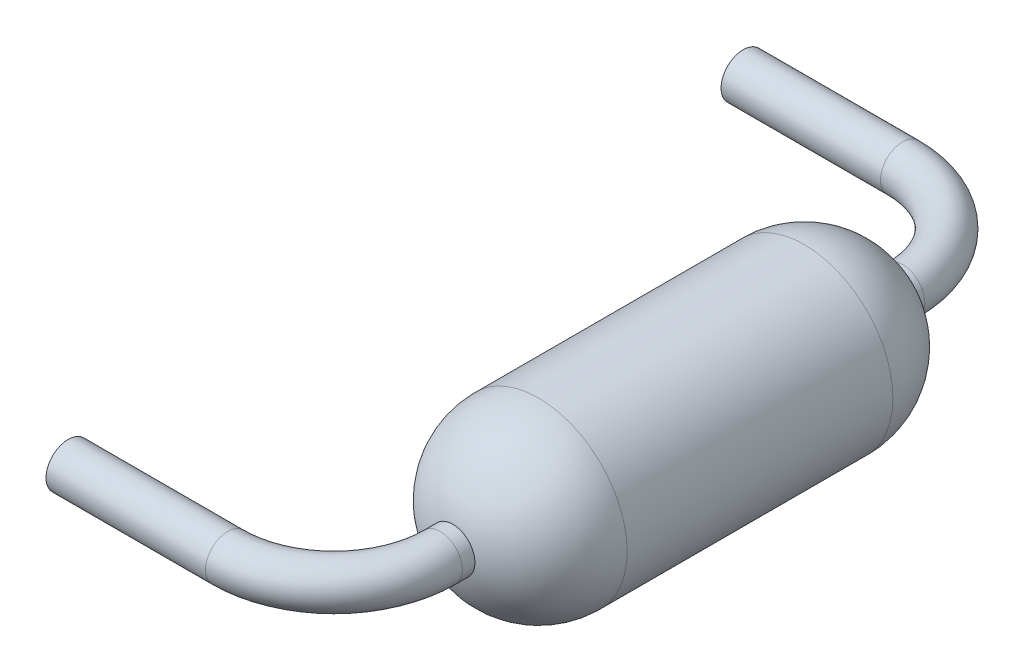
ISO-10303-21;
HEADER;
FILE_DESCRIPTION(('STEP AP214'),'2;1');
FILE_NAME('part.step','',(''),(''),'','','');
FILE_SCHEMA(('AUTOMOTIVE_DESIGN { 1 0 10303 214 1 1 1 1 }'));
ENDSEC;
DATA;
#1=APPLICATION_CONTEXT('core data for automotive mechanical design processes');
#2=APPLICATION_PROTOCOL_DEFINITION('international standard','automotive_design',2000,#1);
#3=PRODUCT_CONTEXT('',#1,'mechanical');
#4=PRODUCT('Part','Part','',(#3));
#5=PRODUCT_RELATED_PRODUCT_CATEGORY('part','',(#4));
#6=PRODUCT_DEFINITION_FORMATION('','',#4);
#7=PRODUCT_DEFINITION_CONTEXT('part definition',#1,'design');
#8=PRODUCT_DEFINITION('design','',#6,#7);
#9=PRODUCT_DEFINITION_SHAPE('','',#8);
#10=(LENGTH_UNIT() NAMED_UNIT(*) SI_UNIT(.MILLI.,.METRE.));
#11=(NAMED_UNIT(*) PLANE_ANGLE_UNIT() SI_UNIT($,.RADIAN.));
#12=(NAMED_UNIT(*) SI_UNIT($,.STERADIAN.) SOLID_ANGLE_UNIT());
#13=UNCERTAINTY_MEASURE_WITH_UNIT(LENGTH_MEASURE(1.E-05),#10,'distance_accuracy_value','');
#14=(GEOMETRIC_REPRESENTATION_CONTEXT(3) GLOBAL_UNCERTAINTY_ASSIGNED_CONTEXT((#13)) GLOBAL_UNIT_ASSIGNED_CONTEXT((#10,
#11,#12)) REPRESENTATION_CONTEXT('',''));
#15=CARTESIAN_POINT('',(0.,0.,0.));
#16=DIRECTION('',(0.,0.,1.));
#17=DIRECTION('',(1.,0.,0.));
#18=AXIS2_PLACEMENT_3D('',#15,#16,#17);
#19=CARTESIAN_POINT('',(0.,0.,1.5));
#20=DIRECTION('',(0.,0.,-1.));
#21=DIRECTION('',(-1.,0.,0.));
#22=AXIS2_PLACEMENT_3D('',#19,#20,#21);
#23=CYLINDRICAL_SURFACE('',#22,1.);
#24=CARTESIAN_POINT('',(0.,0.,1.5));
#25=DIRECTION('',(0.,0.,1.));
#26=DIRECTION('',(1.,0.,0.));
#27=AXIS2_PLACEMENT_3D('',#24,#25,#26);
#28=CIRCLE('',#27,1.);
#29=CARTESIAN_POINT('',(1.,0.,1.5));
#30=VERTEX_POINT('',#29);
#31=EDGE_CURVE('E48',#30,#30,#28,.T.);
#32=ORIENTED_EDGE('',*,*,#31,.F.);
#33=EDGE_LOOP('',(#32));
#34=FACE_BOUND('',#33,.T.);
#35=CARTESIAN_POINT('',(0.,0.,-1.5));
#36=DIRECTION('',(0.,0.,1.));
#37=DIRECTION('',(1.,0.,0.));
#38=AXIS2_PLACEMENT_3D('',#35,#36,#37);
#39=CIRCLE('',#38,1.);
#40=CARTESIAN_POINT('',(1.,0.,-1.5));
#41=VERTEX_POINT('',#40);
#42=EDGE_CURVE('E54',#41,#41,#39,.T.);
#43=ORIENTED_EDGE('',*,*,#42,.T.);
#44=EDGE_LOOP('',(#43));
#45=FACE_BOUND('',#44,.T.);
#46=ADVANCED_FACE('F39',(#34,#45),#23,.T.);
#47=CARTESIAN_POINT('',(0.,0.,1.5));
#48=DIRECTION('',(0.,0.,1.));
#49=DIRECTION('',(1.,0.,0.));
#50=AXIS2_PLACEMENT_3D('',#47,#48,#49);
#51=SPHERICAL_SURFACE('',#50,1.);
#52=CARTESIAN_POINT('',(0.,0.,2.46824583655185));
#53=DIRECTION('',(0.,0.,-1.));
#54=DIRECTION('',(-1.,0.,0.));
#55=AXIS2_PLACEMENT_3D('',#52,#53,#54);
#56=CIRCLE('',#55,0.25);
#57=CARTESIAN_POINT('',(-0.25,0.,2.46824583655185));
#58=VERTEX_POINT('',#57);
#59=EDGE_CURVE('E10',#58,#58,#56,.F.);
#60=ORIENTED_EDGE('',*,*,#59,.F.);
#61=EDGE_LOOP('',(#60));
#62=FACE_BOUND('',#61,.T.);
#63=ORIENTED_EDGE('',*,*,#31,.T.);
#64=EDGE_LOOP('',(#63));
#65=FACE_BOUND('',#64,.T.);
#66=ADVANCED_FACE('F106',(#62,#65),#51,.T.);
#67=CARTESIAN_POINT('',(0.,0.,-1.5));
#68=DIRECTION('',(0.,0.,1.));
#69=DIRECTION('',(1.,0.,0.));
#70=AXIS2_PLACEMENT_3D('',#67,#68,#69);
#71=SPHERICAL_SURFACE('',#70,1.);
#72=CARTESIAN_POINT('',(0.,0.,-2.46824583655185));
#73=DIRECTION('',(0.,0.,1.));
#74=DIRECTION('',(1.,0.,0.));
#75=AXIS2_PLACEMENT_3D('',#72,#73,#74);
#76=CIRCLE('',#75,0.25);
#77=CARTESIAN_POINT('',(0.25,0.,-2.46824583655185));
#78=VERTEX_POINT('',#77);
#79=EDGE_CURVE('E43',#78,#78,#76,.T.);
#80=ORIENTED_EDGE('',*,*,#79,.T.);
#81=EDGE_LOOP('',(#80));
#82=FACE_BOUND('',#81,.T.);
#83=ORIENTED_EDGE('',*,*,#42,.F.);
#84=EDGE_LOOP('',(#83));
#85=FACE_BOUND('',#84,.T.);
#86=ADVANCED_FACE('F41',(#82,#85),#71,.T.);
#87=CARTESIAN_POINT('',(-3.,0.,-3.81));
#88=DIRECTION('',(1.,0.,0.));
#89=DIRECTION('',(0.,0.,-1.));
#90=AXIS2_PLACEMENT_3D('',#87,#88,#89);
#91=PLANE('',#90);
#92=CARTESIAN_POINT('',(-3.,0.,-3.81));
#93=DIRECTION('',(1.,0.,0.));
#94=DIRECTION('',(0.,0.,-1.));
#95=AXIS2_PLACEMENT_3D('',#92,#93,#94);
#96=CIRCLE('',#95,0.25);
#97=CARTESIAN_POINT('',(-3.,0.,-4.06));
#98=VERTEX_POINT('',#97);
#99=EDGE_CURVE('E89',#98,#98,#96,.T.);
#100=ORIENTED_EDGE('',*,*,#99,.F.);
#101=EDGE_LOOP('',(#100));
#102=FACE_BOUND('',#101,.T.);
#103=ADVANCED_FACE('F96',(#102),#91,.F.);
#104=CARTESIAN_POINT('',(-3.,0.,-3.81));
#105=DIRECTION('',(1.,0.,0.));
#106=DIRECTION('',(0.,0.,-1.));
#107=AXIS2_PLACEMENT_3D('',#104,#105,#106);
#108=CYLINDRICAL_SURFACE('',#107,0.25);
#109=CARTESIAN_POINT('',(-1.2,0.,-3.81));
#110=DIRECTION('',(1.,0.,0.));
#111=DIRECTION('',(0.,0.,-1.));
#112=AXIS2_PLACEMENT_3D('',#109,#110,#111);
#113=CIRCLE('',#112,0.25);
#114=CARTESIAN_POINT('',(-1.2,0.,-4.06));
#115=VERTEX_POINT('',#114);
#116=EDGE_CURVE('E85',#115,#115,#113,.T.);
#117=ORIENTED_EDGE('',*,*,#116,.F.);
#118=EDGE_LOOP('',(#117));
#119=FACE_BOUND('',#118,.T.);
#120=ORIENTED_EDGE('',*,*,#99,.T.);
#121=EDGE_LOOP('',(#120));
#122=FACE_BOUND('',#121,.T.);
#123=ADVANCED_FACE('F94',(#119,#122),#108,.T.);
#124=CARTESIAN_POINT('',(-1.2,0.,-2.61));
#125=DIRECTION('',(0.,-1.,0.));
#126=DIRECTION('',(0.,0.,-1.));
#127=AXIS2_PLACEMENT_3D('',#124,#125,#126);
#128=TOROIDAL_SURFACE('',#127,1.2,0.25);
#129=CARTESIAN_POINT('',(0.,0.,-2.61));
#130=DIRECTION('',(0.,0.,1.));
#131=DIRECTION('',(1.,0.,0.));
#132=AXIS2_PLACEMENT_3D('',#129,#130,#131);
#133=CIRCLE('',#132,0.25);
#134=CARTESIAN_POINT('',(0.249999999999999,0.,-2.61));
#135=VERTEX_POINT('',#134);
#136=EDGE_CURVE('E79',#135,#135,#133,.T.);
#137=CARTESIAN_POINT('',(-1.2,0.,-2.61));
#138=DIRECTION('',(0.,-1.,0.));
#139=DIRECTION('',(0.,0.,-1.));
#140=AXIS2_PLACEMENT_3D('',#137,#138,#139);
#141=CIRCLE('',#140,1.45);
#142=EDGE_CURVE('',#115,#135,#141,.T.);
#143=ORIENTED_EDGE('',*,*,#116,.T.);
#144=ORIENTED_EDGE('',*,*,#136,.F.);
#145=ORIENTED_EDGE('',*,*,#142,.T.);
#146=ORIENTED_EDGE('',*,*,#142,.F.);
#147=EDGE_LOOP('',(#143,#145,#144,#146));
#148=FACE_BOUND('',#147,.T.);
#149=ADVANCED_FACE('F103',(#148),#128,.T.);
#150=CARTESIAN_POINT('',(0.,0.,-2.61));
#151=DIRECTION('',(0.,0.,1.));
#152=DIRECTION('',(1.,0.,0.));
#153=AXIS2_PLACEMENT_3D('',#150,#151,#152);
#154=CYLINDRICAL_SURFACE('',#153,0.25);
#155=ORIENTED_EDGE('',*,*,#136,.T.);
#156=EDGE_LOOP('',(#155));
#157=FACE_BOUND('',#156,.T.);
#158=ORIENTED_EDGE('',*,*,#79,.F.);
#159=EDGE_LOOP('',(#158));
#160=FACE_BOUND('',#159,.T.);
#161=ADVANCED_FACE('F142',(#157,#160),#154,.T.);
#162=CARTESIAN_POINT('',(-3.,0.,3.81));
#163=DIRECTION('',(-1.,0.,0.));
#164=DIRECTION('',(0.,0.,1.));
#165=AXIS2_PLACEMENT_3D('',#162,#163,#164);
#166=PLANE('',#165);
#167=CARTESIAN_POINT('',(-3.,0.,3.81));
#168=DIRECTION('',(-1.,0.,0.));
#169=DIRECTION('',(0.,0.,1.));
#170=AXIS2_PLACEMENT_3D('',#167,#168,#169);
#171=CIRCLE('',#170,0.25);
#172=CARTESIAN_POINT('',(-3.,0.,4.06));
#173=VERTEX_POINT('',#172);
#174=EDGE_CURVE('E57',#173,#173,#171,.T.);
#175=ORIENTED_EDGE('',*,*,#174,.T.);
#176=EDGE_LOOP('',(#175));
#177=FACE_BOUND('',#176,.T.);
#178=ADVANCED_FACE('F152',(#177),#166,.T.);
#179=ORIENTED_EDGE('',*,*,#59,.T.);
#180=EDGE_LOOP('',(#179));
#181=FACE_BOUND('',#180,.T.);
#182=CARTESIAN_POINT('',(0.,0.,2.61));
#183=DIRECTION('',(0.,0.,1.));
#184=DIRECTION('',(1.,0.,0.));
#185=AXIS2_PLACEMENT_3D('',#182,#183,#184);
#186=CIRCLE('',#185,0.25);
#187=CARTESIAN_POINT('',(0.25,0.,2.61));
#188=VERTEX_POINT('',#187);
#189=EDGE_CURVE('E74',#188,#188,#186,.T.);
#190=ORIENTED_EDGE('',*,*,#189,.F.);
#191=EDGE_LOOP('',(#190));
#192=FACE_BOUND('',#191,.T.);
#193=ADVANCED_FACE('F155',(#181,#192),#154,.T.);
#194=CARTESIAN_POINT('',(-1.2,0.,2.61));
#195=DIRECTION('',(0.,-1.,0.));
#196=DIRECTION('',(0.,0.,-1.));
#197=AXIS2_PLACEMENT_3D('',#194,#195,#196);
#198=TOROIDAL_SURFACE('',#197,1.2,0.25);
#199=CARTESIAN_POINT('',(-1.2,0.,3.81));
#200=DIRECTION('',(-1.,0.,0.));
#201=DIRECTION('',(0.,0.,1.));
#202=AXIS2_PLACEMENT_3D('',#199,#200,#201);
#203=CIRCLE('',#202,0.25);
#204=CARTESIAN_POINT('',(-1.2,0.,4.06));
#205=VERTEX_POINT('',#204);
#206=EDGE_CURVE('E69',#205,#205,#203,.T.);
#207=CARTESIAN_POINT('',(-1.2,0.,2.61));
#208=DIRECTION('',(0.,-1.,0.));
#209=DIRECTION('',(0.,0.,-1.));
#210=AXIS2_PLACEMENT_3D('',#207,#208,#209);
#211=CIRCLE('',#210,1.45);
#212=EDGE_CURVE('',#188,#205,#211,.T.);
#213=ORIENTED_EDGE('',*,*,#189,.T.);
#214=ORIENTED_EDGE('',*,*,#206,.F.);
#215=ORIENTED_EDGE('',*,*,#212,.T.);
#216=ORIENTED_EDGE('',*,*,#212,.F.);
#217=EDGE_LOOP('',(#213,#215,#214,#216));
#218=FACE_BOUND('',#217,.T.);
#219=ADVANCED_FACE('F171',(#218),#198,.T.);
#220=CARTESIAN_POINT('',(-1.2,0.,3.81));
#221=DIRECTION('',(-1.,0.,0.));
#222=DIRECTION('',(0.,0.,1.));
#223=AXIS2_PLACEMENT_3D('',#220,#221,#222);
#224=CYLINDRICAL_SURFACE('',#223,0.25);
#225=ORIENTED_EDGE('',*,*,#174,.F.);
#226=EDGE_LOOP('',(#225));
#227=FACE_BOUND('',#226,.T.);
#228=ORIENTED_EDGE('',*,*,#206,.T.);
#229=EDGE_LOOP('',(#228));
#230=FACE_BOUND('',#229,.T.);
#231=ADVANCED_FACE('F156',(#227,#230),#224,.T.);
#232=CLOSED_SHELL('',(#46,#66,#86,#103,#123,#149,#161,#178,#193,#219,#231));
#233=MANIFOLD_SOLID_BREP('B2',#232);
#234=ADVANCED_BREP_SHAPE_REPRESENTATION('',(#18,#233),#14);
#235=SHAPE_DEFINITION_REPRESENTATION(#9,#234);
ENDSEC;
END-ISO-10303-21;
